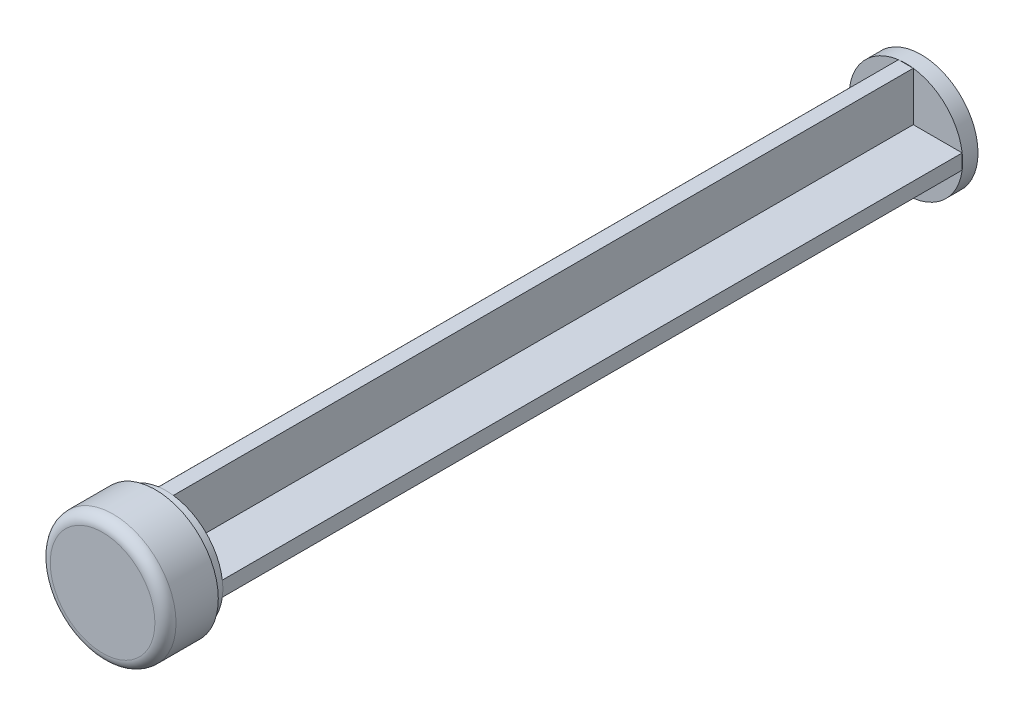
ISO-10303-21;
HEADER;
FILE_DESCRIPTION(('STEP AP214'),'2;1');
FILE_NAME('part.step','',(''),(''),'','','');
FILE_SCHEMA(('AUTOMOTIVE_DESIGN { 1 0 10303 214 1 1 1 1 }'));
ENDSEC;
DATA;
#1=APPLICATION_CONTEXT('core data for automotive mechanical design processes');
#2=APPLICATION_PROTOCOL_DEFINITION('international standard','automotive_design',2000,#1);
#3=PRODUCT_CONTEXT('',#1,'mechanical');
#4=PRODUCT('Part','Part','',(#3));
#5=PRODUCT_RELATED_PRODUCT_CATEGORY('part','',(#4));
#6=PRODUCT_DEFINITION_FORMATION('','',#4);
#7=PRODUCT_DEFINITION_CONTEXT('part definition',#1,'design');
#8=PRODUCT_DEFINITION('design','',#6,#7);
#9=PRODUCT_DEFINITION_SHAPE('','',#8);
#10=(LENGTH_UNIT() NAMED_UNIT(*) SI_UNIT(.MILLI.,.METRE.));
#11=(NAMED_UNIT(*) PLANE_ANGLE_UNIT() SI_UNIT($,.RADIAN.));
#12=(NAMED_UNIT(*) SI_UNIT($,.STERADIAN.) SOLID_ANGLE_UNIT());
#13=UNCERTAINTY_MEASURE_WITH_UNIT(LENGTH_MEASURE(1.E-05),#10,'distance_accuracy_value','');
#14=(GEOMETRIC_REPRESENTATION_CONTEXT(3) GLOBAL_UNCERTAINTY_ASSIGNED_CONTEXT((#13)) GLOBAL_UNIT_ASSIGNED_CONTEXT((#10,
#11,#12)) REPRESENTATION_CONTEXT('',''));
#15=CARTESIAN_POINT('',(0.,0.,0.));
#16=DIRECTION('',(0.,0.,1.));
#17=DIRECTION('',(1.,0.,0.));
#18=AXIS2_PLACEMENT_3D('',#15,#16,#17);
#19=CARTESIAN_POINT('',(0.,0.,-1.));
#20=DIRECTION('',(0.,0.,-1.));
#21=DIRECTION('',(-1.,0.,0.));
#22=AXIS2_PLACEMENT_3D('',#19,#20,#21);
#23=PLANE('',#22);
#24=CARTESIAN_POINT('',(0.,0.,-1.));
#25=DIRECTION('',(0.,0.,-1.));
#26=DIRECTION('',(-1.,0.,0.));
#27=AXIS2_PLACEMENT_3D('',#24,#25,#26);
#28=CIRCLE('',#27,5.375);
#29=CARTESIAN_POINT('',(-0.7,5.32922367704715,-1.));
#30=VERTEX_POINT('',#29);
#31=CARTESIAN_POINT('',(0.7,5.32922367704715,-1.));
#32=VERTEX_POINT('',#31);
#33=EDGE_CURVE('E124',#30,#32,#28,.T.);
#34=ORIENTED_EDGE('',*,*,#33,.T.);
#35=DIRECTION('',(-1.,0.,0.));
#36=VECTOR('',#35,1.);
#37=CARTESIAN_POINT('',(0.,5.32922367704715,-1.));
#38=LINE('',#37,#36);
#39=EDGE_CURVE('E103',#32,#30,#38,.T.);
#40=ORIENTED_EDGE('',*,*,#39,.T.);
#41=EDGE_LOOP('',(#34,#40));
#42=FACE_BOUND('',#41,.T.);
#43=ADVANCED_FACE('F35',(#42),#23,.T.);
#44=CARTESIAN_POINT('',(-5.32856453465659,0.705,-1.));
#45=VERTEX_POINT('',#44);
#46=EDGE_CURVE('E133',#45,#30,#28,.T.);
#47=ORIENTED_EDGE('',*,*,#46,.T.);
#48=DIRECTION('',(0.,-1.,0.));
#49=VECTOR('',#48,1.);
#50=CARTESIAN_POINT('',(-0.7,0.,-1.));
#51=LINE('',#50,#49);
#52=CARTESIAN_POINT('',(-0.7,0.705,-1.));
#53=VERTEX_POINT('',#52);
#54=EDGE_CURVE('E112',#30,#53,#51,.T.);
#55=ORIENTED_EDGE('',*,*,#54,.T.);
#56=DIRECTION('',(-1.,0.,0.));
#57=VECTOR('',#56,1.);
#58=CARTESIAN_POINT('',(0.,0.705,-1.));
#59=LINE('',#58,#57);
#60=EDGE_CURVE('E119',#53,#45,#59,.T.);
#61=ORIENTED_EDGE('',*,*,#60,.T.);
#62=EDGE_LOOP('',(#47,#55,#61));
#63=FACE_BOUND('',#62,.T.);
#64=ADVANCED_FACE('F138',(#63),#23,.T.);
#65=CARTESIAN_POINT('',(-5.32856453465659,-0.705,-1.));
#66=VERTEX_POINT('',#65);
#67=EDGE_CURVE('E141',#66,#45,#28,.T.);
#68=ORIENTED_EDGE('',*,*,#67,.T.);
#69=DIRECTION('',(0.,-1.,0.));
#70=VECTOR('',#69,1.);
#71=CARTESIAN_POINT('',(-5.32856453465659,0.,-1.));
#72=LINE('',#71,#70);
#73=EDGE_CURVE('E180',#45,#66,#72,.T.);
#74=ORIENTED_EDGE('',*,*,#73,.T.);
#75=EDGE_LOOP('',(#68,#74));
#76=FACE_BOUND('',#75,.T.);
#77=ADVANCED_FACE('F260',(#76),#23,.T.);
#78=DIRECTION('',(0.,-1.,0.));
#79=VECTOR('',#78,1.);
#80=CARTESIAN_POINT('',(0.7,0.,-1.));
#81=LINE('',#80,#79);
#82=CARTESIAN_POINT('',(0.7,0.705,-1.));
#83=VERTEX_POINT('',#82);
#84=EDGE_CURVE('E50',#32,#83,#81,.T.);
#85=ORIENTED_EDGE('',*,*,#84,.F.);
#86=CARTESIAN_POINT('',(5.32856453465659,0.705,-1.));
#87=VERTEX_POINT('',#86);
#88=EDGE_CURVE('E136',#32,#87,#28,.T.);
#89=ORIENTED_EDGE('',*,*,#88,.T.);
#90=DIRECTION('',(-1.,0.,0.));
#91=VECTOR('',#90,1.);
#92=CARTESIAN_POINT('',(0.,0.705,-1.));
#93=LINE('',#92,#91);
#94=EDGE_CURVE('E197',#87,#83,#93,.T.);
#95=ORIENTED_EDGE('',*,*,#94,.T.);
#96=EDGE_LOOP('',(#85,#89,#95));
#97=FACE_BOUND('',#96,.T.);
#98=ADVANCED_FACE('F308',(#97),#23,.T.);
#99=DIRECTION('',(-1.,0.,0.));
#100=VECTOR('',#99,1.);
#101=CARTESIAN_POINT('',(0.,-0.705,-1.));
#102=LINE('',#101,#100);
#103=CARTESIAN_POINT('',(-0.7,-0.705,-1.));
#104=VERTEX_POINT('',#103);
#105=EDGE_CURVE('E182',#104,#66,#102,.T.);
#106=ORIENTED_EDGE('',*,*,#105,.F.);
#107=DIRECTION('',(0.,-1.,0.));
#108=VECTOR('',#107,1.);
#109=CARTESIAN_POINT('',(-0.7,0.,-1.));
#110=LINE('',#109,#108);
#111=CARTESIAN_POINT('',(-0.7,-5.32922367704715,-1.));
#112=VERTEX_POINT('',#111);
#113=EDGE_CURVE('E185',#104,#112,#110,.T.);
#114=ORIENTED_EDGE('',*,*,#113,.T.);
#115=EDGE_CURVE('E147',#112,#66,#28,.T.);
#116=ORIENTED_EDGE('',*,*,#115,.T.);
#117=EDGE_LOOP('',(#106,#114,#116));
#118=FACE_BOUND('',#117,.T.);
#119=ADVANCED_FACE('F284',(#118),#23,.T.);
#120=DIRECTION('',(-1.,0.,0.));
#121=VECTOR('',#120,1.);
#122=CARTESIAN_POINT('',(0.,-5.32922367704715,-1.));
#123=LINE('',#122,#121);
#124=CARTESIAN_POINT('',(0.7,-5.32922367704715,-1.));
#125=VERTEX_POINT('',#124);
#126=EDGE_CURVE('E188',#125,#112,#123,.T.);
#127=ORIENTED_EDGE('',*,*,#126,.F.);
#128=EDGE_CURVE('E152',#125,#112,#28,.T.);
#129=ORIENTED_EDGE('',*,*,#128,.T.);
#130=EDGE_LOOP('',(#127,#129));
#131=FACE_BOUND('',#130,.T.);
#132=ADVANCED_FACE('F276',(#131),#23,.T.);
#133=DIRECTION('',(0.,-1.,0.));
#134=VECTOR('',#133,1.);
#135=CARTESIAN_POINT('',(0.7,0.,-1.));
#136=LINE('',#135,#134);
#137=CARTESIAN_POINT('',(0.7,-0.705,-1.));
#138=VERTEX_POINT('',#137);
#139=EDGE_CURVE('E191',#138,#125,#136,.T.);
#140=ORIENTED_EDGE('',*,*,#139,.F.);
#141=DIRECTION('',(-1.,0.,0.));
#142=VECTOR('',#141,1.);
#143=CARTESIAN_POINT('',(0.,-0.705,-1.));
#144=LINE('',#143,#142);
#145=CARTESIAN_POINT('',(5.32856453465659,-0.705000000000017,-1.));
#146=VERTEX_POINT('',#145);
#147=EDGE_CURVE('E193',#146,#138,#144,.T.);
#148=ORIENTED_EDGE('',*,*,#147,.F.);
#149=EDGE_CURVE('E290',#146,#125,#28,.T.);
#150=ORIENTED_EDGE('',*,*,#149,.T.);
#151=EDGE_LOOP('',(#140,#148,#150));
#152=FACE_BOUND('',#151,.T.);
#153=ADVANCED_FACE('F266',(#152),#23,.T.);
#154=CARTESIAN_POINT('',(0.,0.,5.));
#155=DIRECTION('',(0.,0.,-1.));
#156=DIRECTION('',(-1.,0.,0.));
#157=AXIS2_PLACEMENT_3D('',#154,#155,#156);
#158=CYLINDRICAL_SURFACE('',#157,5.95);
#159=CARTESIAN_POINT('',(0.,0.,4.));
#160=DIRECTION('',(0.,0.,1.));
#161=DIRECTION('',(1.,0.,0.));
#162=AXIS2_PLACEMENT_3D('',#159,#160,#161);
#163=CIRCLE('',#162,5.95);
#164=CARTESIAN_POINT('',(5.95,0.,4.));
#165=VERTEX_POINT('',#164);
#166=EDGE_CURVE('E11',#165,#165,#163,.F.);
#167=ORIENTED_EDGE('',*,*,#166,.T.);
#168=EDGE_LOOP('',(#167));
#169=FACE_BOUND('',#168,.T.);
#170=CARTESIAN_POINT('',(0.,0.,0.));
#171=DIRECTION('',(0.,0.,1.));
#172=DIRECTION('',(1.,0.,0.));
#173=AXIS2_PLACEMENT_3D('',#170,#171,#172);
#174=CIRCLE('',#173,5.95);
#175=CARTESIAN_POINT('',(5.95,0.,0.));
#176=VERTEX_POINT('',#175);
#177=EDGE_CURVE('E140',#176,#176,#174,.T.);
#178=ORIENTED_EDGE('',*,*,#177,.T.);
#179=EDGE_LOOP('',(#178));
#180=FACE_BOUND('',#179,.T.);
#181=ADVANCED_FACE('F275',(#169,#180),#158,.T.);
#182=CARTESIAN_POINT('',(0.,0.,5.));
#183=DIRECTION('',(0.,0.,1.));
#184=DIRECTION('',(1.,0.,0.));
#185=AXIS2_PLACEMENT_3D('',#182,#183,#184);
#186=PLANE('',#185);
#187=CARTESIAN_POINT('',(0.,0.,5.));
#188=DIRECTION('',(0.,0.,1.));
#189=DIRECTION('',(1.,0.,0.));
#190=AXIS2_PLACEMENT_3D('',#187,#188,#189);
#191=CIRCLE('',#190,4.95);
#192=CARTESIAN_POINT('',(4.95,0.,5.));
#193=VERTEX_POINT('',#192);
#194=EDGE_CURVE('E43',#193,#193,#191,.T.);
#195=ORIENTED_EDGE('',*,*,#194,.T.);
#196=EDGE_LOOP('',(#195));
#197=FACE_BOUND('',#196,.T.);
#198=ADVANCED_FACE('F282',(#197),#186,.T.);
#199=CARTESIAN_POINT('',(0.,0.,0.));
#200=DIRECTION('',(0.,0.,1.));
#201=DIRECTION('',(1.,0.,0.));
#202=AXIS2_PLACEMENT_3D('',#199,#200,#201);
#203=PLANE('',#202);
#204=CARTESIAN_POINT('',(0.,0.,0.));
#205=DIRECTION('',(0.,0.,-1.));
#206=DIRECTION('',(-1.,0.,0.));
#207=AXIS2_PLACEMENT_3D('',#204,#205,#206);
#208=CIRCLE('',#207,5.375);
#209=CARTESIAN_POINT('',(-5.375,0.,0.));
#210=VERTEX_POINT('',#209);
#211=EDGE_CURVE('E143',#210,#210,#208,.T.);
#212=ORIENTED_EDGE('',*,*,#211,.F.);
#213=EDGE_LOOP('',(#212));
#214=FACE_BOUND('',#213,.T.);
#215=ORIENTED_EDGE('',*,*,#177,.F.);
#216=EDGE_LOOP('',(#215));
#217=FACE_BOUND('',#216,.T.);
#218=ADVANCED_FACE('F272',(#214,#217),#203,.F.);
#219=CARTESIAN_POINT('',(0.,0.,-1.));
#220=DIRECTION('',(0.,0.,1.));
#221=DIRECTION('',(1.,0.,0.));
#222=AXIS2_PLACEMENT_3D('',#219,#220,#221);
#223=CYLINDRICAL_SURFACE('',#222,5.375);
#224=ORIENTED_EDGE('',*,*,#46,.F.);
#225=ORIENTED_EDGE('',*,*,#67,.F.);
#226=ORIENTED_EDGE('',*,*,#115,.F.);
#227=ORIENTED_EDGE('',*,*,#128,.F.);
#228=ORIENTED_EDGE('',*,*,#149,.F.);
#229=EDGE_CURVE('E306',#87,#146,#28,.T.);
#230=ORIENTED_EDGE('',*,*,#229,.F.);
#231=ORIENTED_EDGE('',*,*,#88,.F.);
#232=ORIENTED_EDGE('',*,*,#33,.F.);
#233=EDGE_LOOP('',(#224,#225,#226,#227,#228,#230,#231,#232));
#234=FACE_BOUND('',#233,.T.);
#235=ORIENTED_EDGE('',*,*,#211,.T.);
#236=EDGE_LOOP('',(#235));
#237=FACE_BOUND('',#236,.T.);
#238=ADVANCED_FACE('F130',(#234,#237),#223,.T.);
#239=DIRECTION('',(0.,-1.,0.));
#240=VECTOR('',#239,1.);
#241=CARTESIAN_POINT('',(5.32856453465659,0.,-1.));
#242=LINE('',#241,#240);
#243=EDGE_CURVE('E195',#87,#146,#242,.T.);
#244=ORIENTED_EDGE('',*,*,#243,.F.);
#245=ORIENTED_EDGE('',*,*,#229,.T.);
#246=EDGE_LOOP('',(#244,#245));
#247=FACE_BOUND('',#246,.T.);
#248=ADVANCED_FACE('F256',(#247),#23,.T.);
#249=CARTESIAN_POINT('',(0.7,0.,-71.));
#250=DIRECTION('',(-1.,0.,0.));
#251=DIRECTION('',(0.,0.,1.));
#252=AXIS2_PLACEMENT_3D('',#249,#250,#251);
#253=PLANE('',#252);
#254=ORIENTED_EDGE('',*,*,#84,.T.);
#255=DIRECTION('',(0.,0.,1.));
#256=VECTOR('',#255,1.);
#257=CARTESIAN_POINT('',(0.7,0.705,-71.));
#258=LINE('',#257,#256);
#259=CARTESIAN_POINT('',(0.7,0.705,-71.));
#260=VERTEX_POINT('',#259);
#261=EDGE_CURVE('E148',#260,#83,#258,.T.);
#262=ORIENTED_EDGE('',*,*,#261,.F.);
#263=DIRECTION('',(0.,-1.,0.));
#264=VECTOR('',#263,1.);
#265=CARTESIAN_POINT('',(0.7,0.,-71.));
#266=LINE('',#265,#264);
#267=CARTESIAN_POINT('',(0.700000000000012,5.32922367704715,-71.));
#268=VERTEX_POINT('',#267);
#269=EDGE_CURVE('E125',#268,#260,#266,.T.);
#270=ORIENTED_EDGE('',*,*,#269,.F.);
#271=DIRECTION('',(0.,0.,1.));
#272=VECTOR('',#271,1.);
#273=CARTESIAN_POINT('',(0.7,5.32922367704715,-71.));
#274=LINE('',#273,#272);
#275=EDGE_CURVE('E109',#268,#32,#274,.T.);
#276=ORIENTED_EDGE('',*,*,#275,.T.);
#277=EDGE_LOOP('',(#254,#262,#270,#276));
#278=FACE_BOUND('',#277,.T.);
#279=ADVANCED_FACE('F264',(#278),#253,.F.);
#280=CARTESIAN_POINT('',(0.,0.705,-71.));
#281=DIRECTION('',(0.,1.,0.));
#282=DIRECTION('',(0.,0.,1.));
#283=AXIS2_PLACEMENT_3D('',#280,#281,#282);
#284=PLANE('',#283);
#285=ORIENTED_EDGE('',*,*,#94,.F.);
#286=DIRECTION('',(0.,0.,1.));
#287=VECTOR('',#286,1.);
#288=CARTESIAN_POINT('',(5.32856453465659,0.705,-71.));
#289=LINE('',#288,#287);
#290=CARTESIAN_POINT('',(5.32856453465659,0.705,-71.));
#291=VERTEX_POINT('',#290);
#292=EDGE_CURVE('E153',#291,#87,#289,.T.);
#293=ORIENTED_EDGE('',*,*,#292,.F.);
#294=DIRECTION('',(-1.,0.,0.));
#295=VECTOR('',#294,1.);
#296=CARTESIAN_POINT('',(0.,0.705,-71.));
#297=LINE('',#296,#295);
#298=EDGE_CURVE('E228',#291,#260,#297,.T.);
#299=ORIENTED_EDGE('',*,*,#298,.T.);
#300=ORIENTED_EDGE('',*,*,#261,.T.);
#301=EDGE_LOOP('',(#285,#293,#299,#300));
#302=FACE_BOUND('',#301,.T.);
#303=ADVANCED_FACE('F271',(#302),#284,.T.);
#304=CARTESIAN_POINT('',(5.32856453465659,0.,-71.));
#305=DIRECTION('',(-1.,0.,0.));
#306=DIRECTION('',(0.,0.,1.));
#307=AXIS2_PLACEMENT_3D('',#304,#305,#306);
#308=PLANE('',#307);
#309=ORIENTED_EDGE('',*,*,#243,.T.);
#310=DIRECTION('',(0.,0.,1.));
#311=VECTOR('',#310,1.);
#312=CARTESIAN_POINT('',(5.32856453465659,-0.705000000000017,-71.));
#313=LINE('',#312,#311);
#314=CARTESIAN_POINT('',(5.32856453465659,-0.705000000000029,-71.));
#315=VERTEX_POINT('',#314);
#316=EDGE_CURVE('E158',#315,#146,#313,.T.);
#317=ORIENTED_EDGE('',*,*,#316,.F.);
#318=DIRECTION('',(0.,-1.,0.));
#319=VECTOR('',#318,1.);
#320=CARTESIAN_POINT('',(5.32856453465659,0.,-71.));
#321=LINE('',#320,#319);
#322=EDGE_CURVE('E225',#291,#315,#321,.T.);
#323=ORIENTED_EDGE('',*,*,#322,.F.);
#324=ORIENTED_EDGE('',*,*,#292,.T.);
#325=EDGE_LOOP('',(#309,#317,#323,#324));
#326=FACE_BOUND('',#325,.T.);
#327=ADVANCED_FACE('F314',(#326),#308,.F.);
#328=CARTESIAN_POINT('',(0.,-0.705,-71.));
#329=DIRECTION('',(0.,1.,0.));
#330=DIRECTION('',(0.,0.,1.));
#331=AXIS2_PLACEMENT_3D('',#328,#329,#330);
#332=PLANE('',#331);
#333=ORIENTED_EDGE('',*,*,#147,.T.);
#334=DIRECTION('',(0.,0.,1.));
#335=VECTOR('',#334,1.);
#336=CARTESIAN_POINT('',(0.7,-0.705,-71.));
#337=LINE('',#336,#335);
#338=CARTESIAN_POINT('',(0.7,-0.705,-71.));
#339=VERTEX_POINT('',#338);
#340=EDGE_CURVE('E163',#339,#138,#337,.T.);
#341=ORIENTED_EDGE('',*,*,#340,.F.);
#342=DIRECTION('',(-1.,0.,0.));
#343=VECTOR('',#342,1.);
#344=CARTESIAN_POINT('',(0.,-0.705,-71.));
#345=LINE('',#344,#343);
#346=EDGE_CURVE('E222',#315,#339,#345,.T.);
#347=ORIENTED_EDGE('',*,*,#346,.F.);
#348=ORIENTED_EDGE('',*,*,#316,.T.);
#349=EDGE_LOOP('',(#333,#341,#347,#348));
#350=FACE_BOUND('',#349,.T.);
#351=ADVANCED_FACE('F318',(#350),#332,.F.);
#352=CARTESIAN_POINT('',(0.7,0.,-71.));
#353=DIRECTION('',(-1.,0.,0.));
#354=DIRECTION('',(0.,0.,1.));
#355=AXIS2_PLACEMENT_3D('',#352,#353,#354);
#356=PLANE('',#355);
#357=ORIENTED_EDGE('',*,*,#139,.T.);
#358=DIRECTION('',(0.,0.,1.));
#359=VECTOR('',#358,1.);
#360=CARTESIAN_POINT('',(0.7,-5.32922367704715,-71.));
#361=LINE('',#360,#359);
#362=CARTESIAN_POINT('',(0.7,-5.32922367704716,-71.));
#363=VERTEX_POINT('',#362);
#364=EDGE_CURVE('E166',#363,#125,#361,.T.);
#365=ORIENTED_EDGE('',*,*,#364,.F.);
#366=DIRECTION('',(0.,-1.,0.));
#367=VECTOR('',#366,1.);
#368=CARTESIAN_POINT('',(0.7,0.,-71.));
#369=LINE('',#368,#367);
#370=EDGE_CURVE('E219',#339,#363,#369,.T.);
#371=ORIENTED_EDGE('',*,*,#370,.F.);
#372=ORIENTED_EDGE('',*,*,#340,.T.);
#373=EDGE_LOOP('',(#357,#365,#371,#372));
#374=FACE_BOUND('',#373,.T.);
#375=ADVANCED_FACE('F293',(#374),#356,.F.);
#376=CARTESIAN_POINT('',(0.,-5.32922367704715,-71.));
#377=DIRECTION('',(0.,1.,0.));
#378=DIRECTION('',(0.,0.,1.));
#379=AXIS2_PLACEMENT_3D('',#376,#377,#378);
#380=PLANE('',#379);
#381=ORIENTED_EDGE('',*,*,#126,.T.);
#382=DIRECTION('',(0.,0.,1.));
#383=VECTOR('',#382,1.);
#384=CARTESIAN_POINT('',(-0.7,-5.32922367704715,-71.));
#385=LINE('',#384,#383);
#386=CARTESIAN_POINT('',(-0.700000000000012,-5.32922367704715,-71.));
#387=VERTEX_POINT('',#386);
#388=EDGE_CURVE('E169',#387,#112,#385,.T.);
#389=ORIENTED_EDGE('',*,*,#388,.F.);
#390=DIRECTION('',(-1.,0.,0.));
#391=VECTOR('',#390,1.);
#392=CARTESIAN_POINT('',(0.,-5.32922367704715,-71.));
#393=LINE('',#392,#391);
#394=EDGE_CURVE('E216',#363,#387,#393,.T.);
#395=ORIENTED_EDGE('',*,*,#394,.F.);
#396=ORIENTED_EDGE('',*,*,#364,.T.);
#397=EDGE_LOOP('',(#381,#389,#395,#396));
#398=FACE_BOUND('',#397,.T.);
#399=ADVANCED_FACE('F300',(#398),#380,.F.);
#400=CARTESIAN_POINT('',(-0.7,0.,-71.));
#401=DIRECTION('',(-1.,0.,0.));
#402=DIRECTION('',(0.,0.,1.));
#403=AXIS2_PLACEMENT_3D('',#400,#401,#402);
#404=PLANE('',#403);
#405=ORIENTED_EDGE('',*,*,#113,.F.);
#406=DIRECTION('',(0.,0.,1.));
#407=VECTOR('',#406,1.);
#408=CARTESIAN_POINT('',(-0.7,-0.705,-71.));
#409=LINE('',#408,#407);
#410=CARTESIAN_POINT('',(-0.7,-0.705,-71.));
#411=VERTEX_POINT('',#410);
#412=EDGE_CURVE('E171',#411,#104,#409,.T.);
#413=ORIENTED_EDGE('',*,*,#412,.F.);
#414=DIRECTION('',(0.,-1.,0.));
#415=VECTOR('',#414,1.);
#416=CARTESIAN_POINT('',(-0.7,0.,-71.));
#417=LINE('',#416,#415);
#418=EDGE_CURVE('E213',#411,#387,#417,.T.);
#419=ORIENTED_EDGE('',*,*,#418,.T.);
#420=ORIENTED_EDGE('',*,*,#388,.T.);
#421=EDGE_LOOP('',(#405,#413,#419,#420));
#422=FACE_BOUND('',#421,.T.);
#423=ADVANCED_FACE('F374',(#422),#404,.T.);
#424=CARTESIAN_POINT('',(0.,-0.705,-71.));
#425=DIRECTION('',(0.,1.,0.));
#426=DIRECTION('',(0.,0.,1.));
#427=AXIS2_PLACEMENT_3D('',#424,#425,#426);
#428=PLANE('',#427);
#429=ORIENTED_EDGE('',*,*,#105,.T.);
#430=DIRECTION('',(0.,0.,1.));
#431=VECTOR('',#430,1.);
#432=CARTESIAN_POINT('',(-5.32856453465659,-0.705,-71.));
#433=LINE('',#432,#431);
#434=CARTESIAN_POINT('',(-5.32856453465659,-0.70500000000001,-71.));
#435=VERTEX_POINT('',#434);
#436=EDGE_CURVE('E173',#435,#66,#433,.T.);
#437=ORIENTED_EDGE('',*,*,#436,.F.);
#438=DIRECTION('',(-1.,0.,0.));
#439=VECTOR('',#438,1.);
#440=CARTESIAN_POINT('',(0.,-0.705,-71.));
#441=LINE('',#440,#439);
#442=EDGE_CURVE('E210',#411,#435,#441,.T.);
#443=ORIENTED_EDGE('',*,*,#442,.F.);
#444=ORIENTED_EDGE('',*,*,#412,.T.);
#445=EDGE_LOOP('',(#429,#437,#443,#444));
#446=FACE_BOUND('',#445,.T.);
#447=ADVANCED_FACE('F369',(#446),#428,.F.);
#448=CARTESIAN_POINT('',(-5.32856453465659,0.,-71.));
#449=DIRECTION('',(-1.,0.,0.));
#450=DIRECTION('',(0.,0.,1.));
#451=AXIS2_PLACEMENT_3D('',#448,#449,#450);
#452=PLANE('',#451);
#453=ORIENTED_EDGE('',*,*,#73,.F.);
#454=DIRECTION('',(0.,0.,1.));
#455=VECTOR('',#454,1.);
#456=CARTESIAN_POINT('',(-5.32856453465659,0.705,-71.));
#457=LINE('',#456,#455);
#458=CARTESIAN_POINT('',(-5.32856453465659,0.705,-71.));
#459=VERTEX_POINT('',#458);
#460=EDGE_CURVE('E175',#459,#45,#457,.T.);
#461=ORIENTED_EDGE('',*,*,#460,.F.);
#462=DIRECTION('',(0.,-1.,0.));
#463=VECTOR('',#462,1.);
#464=CARTESIAN_POINT('',(-5.32856453465659,0.,-71.));
#465=LINE('',#464,#463);
#466=EDGE_CURVE('E207',#459,#435,#465,.T.);
#467=ORIENTED_EDGE('',*,*,#466,.T.);
#468=ORIENTED_EDGE('',*,*,#436,.T.);
#469=EDGE_LOOP('',(#453,#461,#467,#468));
#470=FACE_BOUND('',#469,.T.);
#471=ADVANCED_FACE('F359',(#470),#452,.T.);
#472=CARTESIAN_POINT('',(0.,0.705,-71.));
#473=DIRECTION('',(0.,1.,0.));
#474=DIRECTION('',(0.,0.,1.));
#475=AXIS2_PLACEMENT_3D('',#472,#473,#474);
#476=PLANE('',#475);
#477=ORIENTED_EDGE('',*,*,#60,.F.);
#478=DIRECTION('',(0.,0.,1.));
#479=VECTOR('',#478,1.);
#480=CARTESIAN_POINT('',(-0.7,0.705,-71.));
#481=LINE('',#480,#479);
#482=CARTESIAN_POINT('',(-0.7,0.705,-71.));
#483=VERTEX_POINT('',#482);
#484=EDGE_CURVE('E108',#483,#53,#481,.T.);
#485=ORIENTED_EDGE('',*,*,#484,.F.);
#486=DIRECTION('',(-1.,0.,0.));
#487=VECTOR('',#486,1.);
#488=CARTESIAN_POINT('',(0.,0.705,-71.));
#489=LINE('',#488,#487);
#490=EDGE_CURVE('E204',#483,#459,#489,.T.);
#491=ORIENTED_EDGE('',*,*,#490,.T.);
#492=ORIENTED_EDGE('',*,*,#460,.T.);
#493=EDGE_LOOP('',(#477,#485,#491,#492));
#494=FACE_BOUND('',#493,.T.);
#495=ADVANCED_FACE('F361',(#494),#476,.T.);
#496=CARTESIAN_POINT('',(-0.7,0.,-71.));
#497=DIRECTION('',(-1.,0.,0.));
#498=DIRECTION('',(0.,0.,1.));
#499=AXIS2_PLACEMENT_3D('',#496,#497,#498);
#500=PLANE('',#499);
#501=ORIENTED_EDGE('',*,*,#54,.F.);
#502=DIRECTION('',(0.,0.,1.));
#503=VECTOR('',#502,1.);
#504=CARTESIAN_POINT('',(-0.7,5.32922367704715,-71.));
#505=LINE('',#504,#503);
#506=CARTESIAN_POINT('',(-0.7,5.32922367704715,-71.));
#507=VERTEX_POINT('',#506);
#508=EDGE_CURVE('E98',#507,#30,#505,.T.);
#509=ORIENTED_EDGE('',*,*,#508,.F.);
#510=DIRECTION('',(0.,-1.,0.));
#511=VECTOR('',#510,1.);
#512=CARTESIAN_POINT('',(-0.7,0.,-71.));
#513=LINE('',#512,#511);
#514=EDGE_CURVE('E202',#507,#483,#513,.T.);
#515=ORIENTED_EDGE('',*,*,#514,.T.);
#516=ORIENTED_EDGE('',*,*,#484,.T.);
#517=EDGE_LOOP('',(#501,#509,#515,#516));
#518=FACE_BOUND('',#517,.T.);
#519=ADVANCED_FACE('F113',(#518),#500,.T.);
#520=CARTESIAN_POINT('',(0.,5.32922367704715,-71.));
#521=DIRECTION('',(0.,1.,0.));
#522=DIRECTION('',(0.,0.,1.));
#523=AXIS2_PLACEMENT_3D('',#520,#521,#522);
#524=PLANE('',#523);
#525=ORIENTED_EDGE('',*,*,#39,.F.);
#526=ORIENTED_EDGE('',*,*,#275,.F.);
#527=DIRECTION('',(-1.,0.,0.));
#528=VECTOR('',#527,1.);
#529=CARTESIAN_POINT('',(0.,5.32922367704715,-71.));
#530=LINE('',#529,#528);
#531=EDGE_CURVE('E105',#268,#507,#530,.T.);
#532=ORIENTED_EDGE('',*,*,#531,.T.);
#533=ORIENTED_EDGE('',*,*,#508,.T.);
#534=EDGE_LOOP('',(#525,#526,#532,#533));
#535=FACE_BOUND('',#534,.T.);
#536=ADVANCED_FACE('F100',(#535),#524,.T.);
#537=CARTESIAN_POINT('',(0.,0.,4.));
#538=DIRECTION('',(0.,0.,1.));
#539=DIRECTION('',(1.,0.,0.));
#540=AXIS2_PLACEMENT_3D('',#537,#538,#539);
#541=TOROIDAL_SURFACE('',#540,4.95,1.);
#542=ORIENTED_EDGE('',*,*,#166,.F.);
#543=EDGE_LOOP('',(#542));
#544=FACE_BOUND('',#543,.T.);
#545=ORIENTED_EDGE('',*,*,#194,.F.);
#546=EDGE_LOOP('',(#545));
#547=FACE_BOUND('',#546,.T.);
#548=ADVANCED_FACE('F37',(#544,#547),#541,.T.);
#549=CARTESIAN_POINT('',(0.,0.,-71.));
#550=DIRECTION('',(0.,0.,-1.));
#551=DIRECTION('',(-1.,0.,0.));
#552=AXIS2_PLACEMENT_3D('',#549,#550,#551);
#553=PLANE('',#552);
#554=CARTESIAN_POINT('',(0.,0.,-71.));
#555=DIRECTION('',(0.,0.,-1.));
#556=DIRECTION('',(-1.,0.,0.));
#557=AXIS2_PLACEMENT_3D('',#554,#555,#556);
#558=CIRCLE('',#557,5.375);
#559=EDGE_CURVE('E519',#268,#291,#558,.T.);
#560=ORIENTED_EDGE('',*,*,#559,.F.);
#561=ORIENTED_EDGE('',*,*,#269,.T.);
#562=ORIENTED_EDGE('',*,*,#298,.F.);
#563=EDGE_LOOP('',(#560,#561,#562));
#564=FACE_BOUND('',#563,.T.);
#565=ADVANCED_FACE('F444',(#564),#553,.F.);
#566=EDGE_CURVE('E518',#291,#315,#558,.T.);
#567=ORIENTED_EDGE('',*,*,#566,.F.);
#568=ORIENTED_EDGE('',*,*,#322,.T.);
#569=EDGE_LOOP('',(#567,#568));
#570=FACE_BOUND('',#569,.T.);
#571=ADVANCED_FACE('F449',(#570),#553,.F.);
#572=EDGE_CURVE('E326',#315,#363,#558,.T.);
#573=ORIENTED_EDGE('',*,*,#572,.F.);
#574=ORIENTED_EDGE('',*,*,#346,.T.);
#575=ORIENTED_EDGE('',*,*,#370,.T.);
#576=EDGE_LOOP('',(#573,#574,#575));
#577=FACE_BOUND('',#576,.T.);
#578=ADVANCED_FACE('F323',(#577),#553,.F.);
#579=ORIENTED_EDGE('',*,*,#418,.F.);
#580=ORIENTED_EDGE('',*,*,#442,.T.);
#581=EDGE_CURVE('E354',#387,#435,#558,.T.);
#582=ORIENTED_EDGE('',*,*,#581,.F.);
#583=EDGE_LOOP('',(#579,#580,#582));
#584=FACE_BOUND('',#583,.T.);
#585=ADVANCED_FACE('F466',(#584),#553,.F.);
#586=ORIENTED_EDGE('',*,*,#466,.F.);
#587=EDGE_CURVE('E234',#435,#459,#558,.T.);
#588=ORIENTED_EDGE('',*,*,#587,.F.);
#589=EDGE_LOOP('',(#586,#588));
#590=FACE_BOUND('',#589,.T.);
#591=ADVANCED_FACE('F348',(#590),#553,.F.);
#592=ORIENTED_EDGE('',*,*,#490,.F.);
#593=ORIENTED_EDGE('',*,*,#514,.F.);
#594=EDGE_CURVE('E59',#459,#507,#558,.T.);
#595=ORIENTED_EDGE('',*,*,#594,.F.);
#596=EDGE_LOOP('',(#592,#593,#595));
#597=FACE_BOUND('',#596,.T.);
#598=ADVANCED_FACE('F250',(#597),#553,.F.);
#599=ORIENTED_EDGE('',*,*,#531,.F.);
#600=EDGE_CURVE('E233',#507,#268,#558,.T.);
#601=ORIENTED_EDGE('',*,*,#600,.F.);
#602=EDGE_LOOP('',(#599,#601));
#603=FACE_BOUND('',#602,.T.);
#604=ADVANCED_FACE('F242',(#603),#553,.F.);
#605=CARTESIAN_POINT('',(0.,0.,-72.45));
#606=DIRECTION('',(0.,0.,1.));
#607=DIRECTION('',(1.,0.,0.));
#608=AXIS2_PLACEMENT_3D('',#605,#606,#607);
#609=CYLINDRICAL_SURFACE('',#608,5.375);
#610=CARTESIAN_POINT('',(0.,0.,-72.45));
#611=DIRECTION('',(0.,0.,-1.));
#612=DIRECTION('',(-1.,0.,0.));
#613=AXIS2_PLACEMENT_3D('',#610,#611,#612);
#614=CIRCLE('',#613,5.375);
#615=CARTESIAN_POINT('',(-5.375,0.,-72.45));
#616=VERTEX_POINT('',#615);
#617=EDGE_CURVE('E200',#616,#616,#614,.T.);
#618=ORIENTED_EDGE('',*,*,#617,.F.);
#619=EDGE_LOOP('',(#618));
#620=FACE_BOUND('',#619,.T.);
#621=ORIENTED_EDGE('',*,*,#594,.T.);
#622=ORIENTED_EDGE('',*,*,#600,.T.);
#623=ORIENTED_EDGE('',*,*,#559,.T.);
#624=ORIENTED_EDGE('',*,*,#566,.T.);
#625=ORIENTED_EDGE('',*,*,#572,.T.);
#626=EDGE_CURVE('E515',#363,#387,#558,.T.);
#627=ORIENTED_EDGE('',*,*,#626,.T.);
#628=ORIENTED_EDGE('',*,*,#581,.T.);
#629=ORIENTED_EDGE('',*,*,#587,.T.);
#630=EDGE_LOOP('',(#621,#622,#623,#624,#625,#627,#628,#629));
#631=FACE_BOUND('',#630,.T.);
#632=ADVANCED_FACE('F240',(#620,#631),#609,.T.);
#633=CARTESIAN_POINT('',(0.,0.,-72.45));
#634=DIRECTION('',(0.,0.,-1.));
#635=DIRECTION('',(-1.,0.,0.));
#636=AXIS2_PLACEMENT_3D('',#633,#634,#635);
#637=PLANE('',#636);
#638=ORIENTED_EDGE('',*,*,#617,.T.);
#639=EDGE_LOOP('',(#638));
#640=FACE_BOUND('',#639,.T.);
#641=ADVANCED_FACE('F238',(#640),#637,.T.);
#642=ORIENTED_EDGE('',*,*,#626,.F.);
#643=ORIENTED_EDGE('',*,*,#394,.T.);
#644=EDGE_LOOP('',(#642,#643));
#645=FACE_BOUND('',#644,.T.);
#646=ADVANCED_FACE('F248',(#645),#553,.F.);
#647=CLOSED_SHELL('',(#43,#64,#77,#98,#119,#132,#153,#181,#198,#218,#238,#248,#279,#303,#327,
#351,#375,#399,#423,#447,#471,#495,#519,#536,#548,#565,#571,#578,#585,#591,#598,#604,#632,#641,#646));
#648=MANIFOLD_SOLID_BREP('B2',#647);
#649=ADVANCED_BREP_SHAPE_REPRESENTATION('',(#18,#648),#14);
#650=SHAPE_DEFINITION_REPRESENTATION(#9,#649);
ENDSEC;
END-ISO-10303-21;
